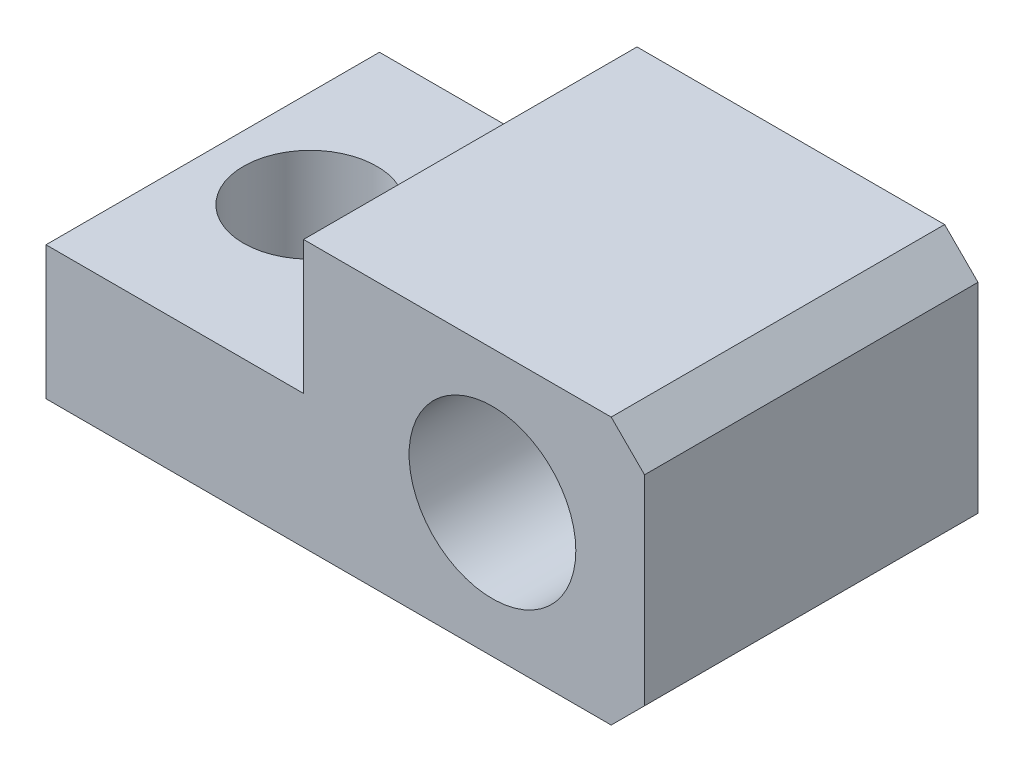
ISO-10303-21;
HEADER;
FILE_DESCRIPTION(('STEP AP214'),'2;1');
FILE_NAME('part.step','',(''),(''),'','','');
FILE_SCHEMA(('AUTOMOTIVE_DESIGN { 1 0 10303 214 1 1 1 1 }'));
ENDSEC;
DATA;
#1=APPLICATION_CONTEXT('core data for automotive mechanical design processes');
#2=APPLICATION_PROTOCOL_DEFINITION('international standard','automotive_design',2000,#1);
#3=PRODUCT_CONTEXT('',#1,'mechanical');
#4=PRODUCT('Part','Part','',(#3));
#5=PRODUCT_RELATED_PRODUCT_CATEGORY('part','',(#4));
#6=PRODUCT_DEFINITION_FORMATION('','',#4);
#7=PRODUCT_DEFINITION_CONTEXT('part definition',#1,'design');
#8=PRODUCT_DEFINITION('design','',#6,#7);
#9=PRODUCT_DEFINITION_SHAPE('','',#8);
#10=(LENGTH_UNIT() NAMED_UNIT(*) SI_UNIT(.MILLI.,.METRE.));
#11=(NAMED_UNIT(*) PLANE_ANGLE_UNIT() SI_UNIT($,.RADIAN.));
#12=(NAMED_UNIT(*) SI_UNIT($,.STERADIAN.) SOLID_ANGLE_UNIT());
#13=UNCERTAINTY_MEASURE_WITH_UNIT(LENGTH_MEASURE(1.E-05),#10,'distance_accuracy_value','');
#14=(GEOMETRIC_REPRESENTATION_CONTEXT(3) GLOBAL_UNCERTAINTY_ASSIGNED_CONTEXT((#13)) GLOBAL_UNIT_ASSIGNED_CONTEXT((#10,
#11,#12)) REPRESENTATION_CONTEXT('',''));
#15=CARTESIAN_POINT('',(0.,0.,0.));
#16=DIRECTION('',(0.,0.,1.));
#17=DIRECTION('',(1.,0.,0.));
#18=AXIS2_PLACEMENT_3D('',#15,#16,#17);
#19=CARTESIAN_POINT('',(4.5608365215788,-4.,10.));
#20=DIRECTION('',(0.,0.,-1.));
#21=DIRECTION('',(-1.,0.,0.));
#22=AXIS2_PLACEMENT_3D('',#19,#20,#21);
#23=PLANE('',#22);
#24=DIRECTION('',(1.,0.,0.));
#25=VECTOR('',#24,1.);
#26=CARTESIAN_POINT('',(-13.388952431753,-4.,10.));
#27=LINE('',#26,#25);
#28=CARTESIAN_POINT('',(-13.388952431753,-4.,10.));
#29=VERTEX_POINT('',#28);
#30=CARTESIAN_POINT('',(3.5608365215788,-4.,10.));
#31=VERTEX_POINT('',#30);
#32=EDGE_CURVE('E144',#29,#31,#27,.T.);
#33=ORIENTED_EDGE('',*,*,#32,.T.);
#34=DIRECTION('',(0.707106781186548,0.707106781186548,0.));
#35=VECTOR('',#34,1.);
#36=CARTESIAN_POINT('',(3.5608365215788,-4.,10.));
#37=LINE('',#36,#35);
#38=CARTESIAN_POINT('',(4.5608365215788,-3.,10.));
#39=VERTEX_POINT('',#38);
#40=EDGE_CURVE('E92',#31,#39,#37,.T.);
#41=ORIENTED_EDGE('',*,*,#40,.T.);
#42=DIRECTION('',(0.,1.,0.));
#43=VECTOR('',#42,1.);
#44=CARTESIAN_POINT('',(4.5608365215788,3.,10.));
#45=LINE('',#44,#43);
#46=CARTESIAN_POINT('',(4.5608365215788,3.,10.));
#47=VERTEX_POINT('',#46);
#48=EDGE_CURVE('E159',#39,#47,#45,.T.);
#49=ORIENTED_EDGE('',*,*,#48,.T.);
#50=DIRECTION('',(-0.707106781186548,0.707106781186547,0.));
#51=VECTOR('',#50,1.);
#52=CARTESIAN_POINT('',(3.56083652157879,4.,10.));
#53=LINE('',#52,#51);
#54=CARTESIAN_POINT('',(3.56083652157879,4.,10.));
#55=VERTEX_POINT('',#54);
#56=EDGE_CURVE('E172',#47,#55,#53,.T.);
#57=ORIENTED_EDGE('',*,*,#56,.T.);
#58=DIRECTION('',(-1.,0.,0.));
#59=VECTOR('',#58,1.);
#60=CARTESIAN_POINT('',(-5.66536116388416,4.,10.));
#61=LINE('',#60,#59);
#62=CARTESIAN_POINT('',(-5.66536116388416,4.,10.));
#63=VERTEX_POINT('',#62);
#64=EDGE_CURVE('E111',#55,#63,#61,.T.);
#65=ORIENTED_EDGE('',*,*,#64,.T.);
#66=DIRECTION('',(0.,-1.,0.));
#67=VECTOR('',#66,1.);
#68=CARTESIAN_POINT('',(-5.66536116388416,0.,10.));
#69=LINE('',#68,#67);
#70=CARTESIAN_POINT('',(-5.66536116388416,0.,10.));
#71=VERTEX_POINT('',#70);
#72=EDGE_CURVE('E105',#63,#71,#69,.T.);
#73=ORIENTED_EDGE('',*,*,#72,.T.);
#74=DIRECTION('',(-1.,0.,0.));
#75=VECTOR('',#74,1.);
#76=CARTESIAN_POINT('',(-5.66536116388416,0.,10.));
#77=LINE('',#76,#75);
#78=CARTESIAN_POINT('',(-13.388952431753,0.,10.));
#79=VERTEX_POINT('',#78);
#80=EDGE_CURVE('E109',#71,#79,#77,.T.);
#81=ORIENTED_EDGE('',*,*,#80,.T.);
#82=DIRECTION('',(0.,-1.,0.));
#83=VECTOR('',#82,1.);
#84=CARTESIAN_POINT('',(-13.388952431753,0.,10.));
#85=LINE('',#84,#83);
#86=EDGE_CURVE('E49',#79,#29,#85,.T.);
#87=ORIENTED_EDGE('',*,*,#86,.T.);
#88=EDGE_LOOP('',(#33,#41,#49,#57,#65,#73,#81,#87));
#89=FACE_BOUND('',#88,.T.);
#90=CARTESIAN_POINT('',(0.,0.,10.));
#91=DIRECTION('',(0.,0.,1.));
#92=DIRECTION('',(1.,0.,0.));
#93=AXIS2_PLACEMENT_3D('',#90,#91,#92);
#94=CIRCLE('',#93,2.5);
#95=CARTESIAN_POINT('',(2.5,0.,10.));
#96=VERTEX_POINT('',#95);
#97=EDGE_CURVE('E133',#96,#96,#94,.T.);
#98=ORIENTED_EDGE('',*,*,#97,.F.);
#99=EDGE_LOOP('',(#98));
#100=FACE_BOUND('',#99,.T.);
#101=ADVANCED_FACE('F32',(#89,#100),#23,.F.);
#102=CARTESIAN_POINT('',(4.5608365215788,-4.,0.));
#103=DIRECTION('',(0.,0.,-1.));
#104=DIRECTION('',(-1.,0.,0.));
#105=AXIS2_PLACEMENT_3D('',#102,#103,#104);
#106=PLANE('',#105);
#107=DIRECTION('',(1.,0.,0.));
#108=VECTOR('',#107,1.);
#109=CARTESIAN_POINT('',(-13.388952431753,-4.,0.));
#110=LINE('',#109,#108);
#111=CARTESIAN_POINT('',(-13.388952431753,-4.,0.));
#112=VERTEX_POINT('',#111);
#113=CARTESIAN_POINT('',(3.5608365215788,-4.,0.));
#114=VERTEX_POINT('',#113);
#115=EDGE_CURVE('E129',#112,#114,#110,.T.);
#116=ORIENTED_EDGE('',*,*,#115,.F.);
#117=DIRECTION('',(0.,-1.,0.));
#118=VECTOR('',#117,1.);
#119=CARTESIAN_POINT('',(-13.388952431753,0.,0.));
#120=LINE('',#119,#118);
#121=CARTESIAN_POINT('',(-13.388952431753,0.,0.));
#122=VERTEX_POINT('',#121);
#123=EDGE_CURVE('E84',#122,#112,#120,.T.);
#124=ORIENTED_EDGE('',*,*,#123,.F.);
#125=DIRECTION('',(-1.,0.,0.));
#126=VECTOR('',#125,1.);
#127=CARTESIAN_POINT('',(-5.66536116388416,0.,0.));
#128=LINE('',#127,#126);
#129=CARTESIAN_POINT('',(-5.66536116388416,0.,0.));
#130=VERTEX_POINT('',#129);
#131=EDGE_CURVE('E78',#130,#122,#128,.T.);
#132=ORIENTED_EDGE('',*,*,#131,.F.);
#133=DIRECTION('',(0.,-1.,0.));
#134=VECTOR('',#133,1.);
#135=CARTESIAN_POINT('',(-5.66536116388416,0.,0.));
#136=LINE('',#135,#134);
#137=CARTESIAN_POINT('',(-5.66536116388416,4.,0.));
#138=VERTEX_POINT('',#137);
#139=EDGE_CURVE('E119',#138,#130,#136,.T.);
#140=ORIENTED_EDGE('',*,*,#139,.F.);
#141=DIRECTION('',(-1.,0.,0.));
#142=VECTOR('',#141,1.);
#143=CARTESIAN_POINT('',(-5.66536116388416,4.,0.));
#144=LINE('',#143,#142);
#145=CARTESIAN_POINT('',(3.56083652157879,4.,0.));
#146=VERTEX_POINT('',#145);
#147=EDGE_CURVE('E139',#146,#138,#144,.T.);
#148=ORIENTED_EDGE('',*,*,#147,.F.);
#149=DIRECTION('',(-0.707106781186548,0.707106781186547,0.));
#150=VECTOR('',#149,1.);
#151=CARTESIAN_POINT('',(3.56083652157879,4.,0.));
#152=LINE('',#151,#150);
#153=CARTESIAN_POINT('',(4.5608365215788,3.,0.));
#154=VERTEX_POINT('',#153);
#155=EDGE_CURVE('E137',#154,#146,#152,.T.);
#156=ORIENTED_EDGE('',*,*,#155,.F.);
#157=DIRECTION('',(0.,1.,0.));
#158=VECTOR('',#157,1.);
#159=CARTESIAN_POINT('',(4.5608365215788,3.,0.));
#160=LINE('',#159,#158);
#161=CARTESIAN_POINT('',(4.5608365215788,-3.,0.));
#162=VERTEX_POINT('',#161);
#163=EDGE_CURVE('E135',#162,#154,#160,.T.);
#164=ORIENTED_EDGE('',*,*,#163,.F.);
#165=DIRECTION('',(0.707106781186548,0.707106781186548,0.));
#166=VECTOR('',#165,1.);
#167=CARTESIAN_POINT('',(3.5608365215788,-4.,0.));
#168=LINE('',#167,#166);
#169=EDGE_CURVE('E132',#114,#162,#168,.T.);
#170=ORIENTED_EDGE('',*,*,#169,.F.);
#171=EDGE_LOOP('',(#116,#124,#132,#140,#148,#156,#164,#170));
#172=FACE_BOUND('',#171,.T.);
#173=CARTESIAN_POINT('',(0.,0.,0.));
#174=DIRECTION('',(0.,0.,1.));
#175=DIRECTION('',(1.,0.,0.));
#176=AXIS2_PLACEMENT_3D('',#173,#174,#175);
#177=CIRCLE('',#176,2.5);
#178=CARTESIAN_POINT('',(2.5,0.,0.));
#179=VERTEX_POINT('',#178);
#180=EDGE_CURVE('E178',#179,#179,#177,.T.);
#181=ORIENTED_EDGE('',*,*,#180,.T.);
#182=EDGE_LOOP('',(#181));
#183=FACE_BOUND('',#182,.T.);
#184=ADVANCED_FACE('F163',(#172,#183),#106,.T.);
#185=CARTESIAN_POINT('',(-13.388952431753,-4.,10.));
#186=DIRECTION('',(0.,1.,0.));
#187=DIRECTION('',(-1.,0.,0.));
#188=AXIS2_PLACEMENT_3D('',#185,#186,#187);
#189=PLANE('',#188);
#190=CARTESIAN_POINT('',(-10.4667860928423,-4.,5.));
#191=DIRECTION('',(0.,1.,0.));
#192=DIRECTION('',(0.,0.,1.));
#193=AXIS2_PLACEMENT_3D('',#190,#191,#192);
#194=CIRCLE('',#193,2.);
#195=CARTESIAN_POINT('',(-10.4667860928423,-4.,7.));
#196=VERTEX_POINT('',#195);
#197=EDGE_CURVE('E181',#196,#196,#194,.T.);
#198=ORIENTED_EDGE('',*,*,#197,.T.);
#199=EDGE_LOOP('',(#198));
#200=FACE_BOUND('',#199,.T.);
#201=ORIENTED_EDGE('',*,*,#115,.T.);
#202=DIRECTION('',(0.,0.,-1.));
#203=VECTOR('',#202,1.);
#204=CARTESIAN_POINT('',(3.5608365215788,-4.,10.));
#205=LINE('',#204,#203);
#206=EDGE_CURVE('E11',#31,#114,#205,.T.);
#207=ORIENTED_EDGE('',*,*,#206,.F.);
#208=ORIENTED_EDGE('',*,*,#32,.F.);
#209=DIRECTION('',(0.,0.,-1.));
#210=VECTOR('',#209,1.);
#211=CARTESIAN_POINT('',(-13.388952431753,-4.,10.));
#212=LINE('',#211,#210);
#213=EDGE_CURVE('E125',#29,#112,#212,.T.);
#214=ORIENTED_EDGE('',*,*,#213,.T.);
#215=EDGE_LOOP('',(#201,#207,#208,#214));
#216=FACE_BOUND('',#215,.T.);
#217=ADVANCED_FACE('F34',(#200,#216),#189,.F.);
#218=CARTESIAN_POINT('',(3.5608365215788,-4.,10.));
#219=DIRECTION('',(-0.707106781186548,0.707106781186548,0.));
#220=DIRECTION('',(-0.707106781186548,-0.707106781186548,0.));
#221=AXIS2_PLACEMENT_3D('',#218,#219,#220);
#222=PLANE('',#221);
#223=ORIENTED_EDGE('',*,*,#169,.T.);
#224=DIRECTION('',(0.,0.,-1.));
#225=VECTOR('',#224,1.);
#226=CARTESIAN_POINT('',(4.5608365215788,-3.,10.));
#227=LINE('',#226,#225);
#228=EDGE_CURVE('E41',#39,#162,#227,.T.);
#229=ORIENTED_EDGE('',*,*,#228,.F.);
#230=ORIENTED_EDGE('',*,*,#40,.F.);
#231=ORIENTED_EDGE('',*,*,#206,.T.);
#232=EDGE_LOOP('',(#223,#229,#230,#231));
#233=FACE_BOUND('',#232,.T.);
#234=ADVANCED_FACE('F242',(#233),#222,.F.);
#235=CARTESIAN_POINT('',(4.5608365215788,3.,10.));
#236=DIRECTION('',(-1.,0.,0.));
#237=DIRECTION('',(0.,0.,1.));
#238=AXIS2_PLACEMENT_3D('',#235,#236,#237);
#239=PLANE('',#238);
#240=ORIENTED_EDGE('',*,*,#163,.T.);
#241=DIRECTION('',(0.,0.,-1.));
#242=VECTOR('',#241,1.);
#243=CARTESIAN_POINT('',(4.5608365215788,3.,10.));
#244=LINE('',#243,#242);
#245=EDGE_CURVE('E151',#47,#154,#244,.T.);
#246=ORIENTED_EDGE('',*,*,#245,.F.);
#247=ORIENTED_EDGE('',*,*,#48,.F.);
#248=ORIENTED_EDGE('',*,*,#228,.T.);
#249=EDGE_LOOP('',(#240,#246,#247,#248));
#250=FACE_BOUND('',#249,.T.);
#251=ADVANCED_FACE('F157',(#250),#239,.F.);
#252=CARTESIAN_POINT('',(3.56083652157879,4.,10.));
#253=DIRECTION('',(-0.707106781186547,-0.707106781186548,0.));
#254=DIRECTION('',(0.707106781186548,-0.707106781186547,0.));
#255=AXIS2_PLACEMENT_3D('',#252,#253,#254);
#256=PLANE('',#255);
#257=ORIENTED_EDGE('',*,*,#155,.T.);
#258=DIRECTION('',(0.,0.,-1.));
#259=VECTOR('',#258,1.);
#260=CARTESIAN_POINT('',(3.56083652157879,4.,10.));
#261=LINE('',#260,#259);
#262=EDGE_CURVE('E148',#55,#146,#261,.T.);
#263=ORIENTED_EDGE('',*,*,#262,.F.);
#264=ORIENTED_EDGE('',*,*,#56,.F.);
#265=ORIENTED_EDGE('',*,*,#245,.T.);
#266=EDGE_LOOP('',(#257,#263,#264,#265));
#267=FACE_BOUND('',#266,.T.);
#268=ADVANCED_FACE('F168',(#267),#256,.F.);
#269=CARTESIAN_POINT('',(-5.66536116388416,4.,10.));
#270=DIRECTION('',(0.,-1.,0.));
#271=DIRECTION('',(0.,0.,-1.));
#272=AXIS2_PLACEMENT_3D('',#269,#270,#271);
#273=PLANE('',#272);
#274=ORIENTED_EDGE('',*,*,#147,.T.);
#275=DIRECTION('',(0.,0.,-1.));
#276=VECTOR('',#275,1.);
#277=CARTESIAN_POINT('',(-5.66536116388416,4.,10.));
#278=LINE('',#277,#276);
#279=EDGE_CURVE('E120',#63,#138,#278,.T.);
#280=ORIENTED_EDGE('',*,*,#279,.F.);
#281=ORIENTED_EDGE('',*,*,#64,.F.);
#282=ORIENTED_EDGE('',*,*,#262,.T.);
#283=EDGE_LOOP('',(#274,#280,#281,#282));
#284=FACE_BOUND('',#283,.T.);
#285=ADVANCED_FACE('F171',(#284),#273,.F.);
#286=CARTESIAN_POINT('',(-5.66536116388416,0.,10.));
#287=DIRECTION('',(1.,0.,0.));
#288=DIRECTION('',(0.,0.,-1.));
#289=AXIS2_PLACEMENT_3D('',#286,#287,#288);
#290=PLANE('',#289);
#291=ORIENTED_EDGE('',*,*,#139,.T.);
#292=DIRECTION('',(0.,0.,-1.));
#293=VECTOR('',#292,1.);
#294=CARTESIAN_POINT('',(-5.66536116388416,0.,10.));
#295=LINE('',#294,#293);
#296=EDGE_CURVE('E116',#71,#130,#295,.T.);
#297=ORIENTED_EDGE('',*,*,#296,.F.);
#298=ORIENTED_EDGE('',*,*,#72,.F.);
#299=ORIENTED_EDGE('',*,*,#279,.T.);
#300=EDGE_LOOP('',(#291,#297,#298,#299));
#301=FACE_BOUND('',#300,.T.);
#302=ADVANCED_FACE('F117',(#301),#290,.F.);
#303=CARTESIAN_POINT('',(-5.66536116388416,0.,10.));
#304=DIRECTION('',(0.,-1.,0.));
#305=DIRECTION('',(0.,0.,-1.));
#306=AXIS2_PLACEMENT_3D('',#303,#304,#305);
#307=PLANE('',#306);
#308=CARTESIAN_POINT('',(-10.4667860928423,0.,5.));
#309=DIRECTION('',(0.,1.,0.));
#310=DIRECTION('',(0.,0.,1.));
#311=AXIS2_PLACEMENT_3D('',#308,#309,#310);
#312=CIRCLE('',#311,2.);
#313=CARTESIAN_POINT('',(-10.4667860928423,0.,7.));
#314=VERTEX_POINT('',#313);
#315=EDGE_CURVE('E184',#314,#314,#312,.T.);
#316=ORIENTED_EDGE('',*,*,#315,.F.);
#317=EDGE_LOOP('',(#316));
#318=FACE_BOUND('',#317,.T.);
#319=ORIENTED_EDGE('',*,*,#131,.T.);
#320=DIRECTION('',(0.,0.,-1.));
#321=VECTOR('',#320,1.);
#322=CARTESIAN_POINT('',(-13.388952431753,0.,10.));
#323=LINE('',#322,#321);
#324=EDGE_CURVE('E121',#79,#122,#323,.T.);
#325=ORIENTED_EDGE('',*,*,#324,.F.);
#326=ORIENTED_EDGE('',*,*,#80,.F.);
#327=ORIENTED_EDGE('',*,*,#296,.T.);
#328=EDGE_LOOP('',(#319,#325,#326,#327));
#329=FACE_BOUND('',#328,.T.);
#330=ADVANCED_FACE('F123',(#318,#329),#307,.F.);
#331=CARTESIAN_POINT('',(-13.388952431753,0.,10.));
#332=DIRECTION('',(1.,0.,0.));
#333=DIRECTION('',(0.,1.,0.));
#334=AXIS2_PLACEMENT_3D('',#331,#332,#333);
#335=PLANE('',#334);
#336=ORIENTED_EDGE('',*,*,#123,.T.);
#337=ORIENTED_EDGE('',*,*,#213,.F.);
#338=ORIENTED_EDGE('',*,*,#86,.F.);
#339=ORIENTED_EDGE('',*,*,#324,.T.);
#340=EDGE_LOOP('',(#336,#337,#338,#339));
#341=FACE_BOUND('',#340,.T.);
#342=ADVANCED_FACE('F200',(#341),#335,.F.);
#343=CARTESIAN_POINT('',(0.,0.,10.));
#344=DIRECTION('',(0.,0.,-1.));
#345=DIRECTION('',(-1.,0.,0.));
#346=AXIS2_PLACEMENT_3D('',#343,#344,#345);
#347=CYLINDRICAL_SURFACE('',#346,2.5);
#348=ORIENTED_EDGE('',*,*,#97,.T.);
#349=EDGE_LOOP('',(#348));
#350=FACE_BOUND('',#349,.T.);
#351=ORIENTED_EDGE('',*,*,#180,.F.);
#352=EDGE_LOOP('',(#351));
#353=FACE_BOUND('',#352,.T.);
#354=ADVANCED_FACE('F195',(#350,#353),#347,.F.);
#355=CARTESIAN_POINT('',(-10.4667860928423,-4.,5.));
#356=DIRECTION('',(0.,1.,0.));
#357=DIRECTION('',(0.,0.,1.));
#358=AXIS2_PLACEMENT_3D('',#355,#356,#357);
#359=CYLINDRICAL_SURFACE('',#358,2.);
#360=ORIENTED_EDGE('',*,*,#197,.F.);
#361=EDGE_LOOP('',(#360));
#362=FACE_BOUND('',#361,.T.);
#363=ORIENTED_EDGE('',*,*,#315,.T.);
#364=EDGE_LOOP('',(#363));
#365=FACE_BOUND('',#364,.T.);
#366=ADVANCED_FACE('F192',(#362,#365),#359,.F.);
#367=CLOSED_SHELL('',(#101,#184,#217,#234,#251,#268,#285,#302,#330,#342,#354,#366));
#368=MANIFOLD_SOLID_BREP('B2',#367);
#369=ADVANCED_BREP_SHAPE_REPRESENTATION('',(#18,#368),#14);
#370=SHAPE_DEFINITION_REPRESENTATION(#9,#369);
ENDSEC;
END-ISO-10303-21;
